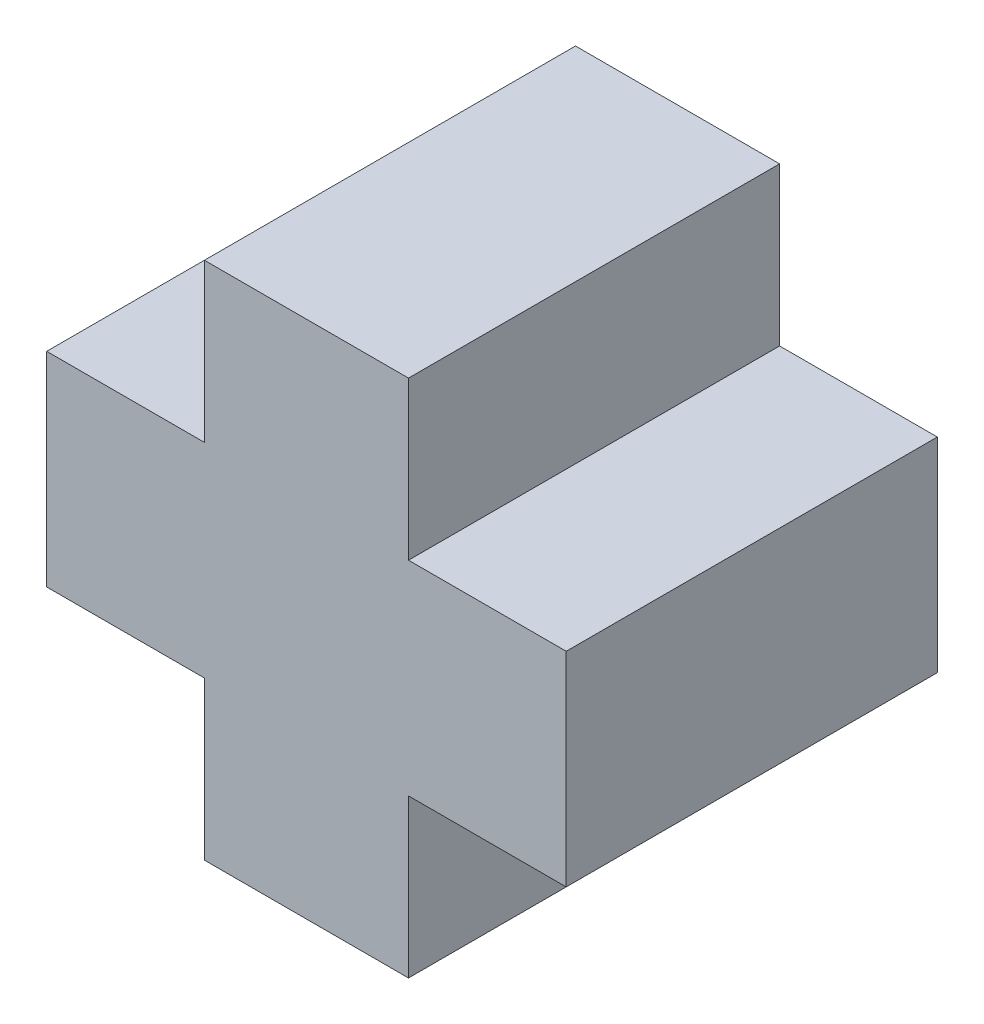
ISO-10303-21;
HEADER;
FILE_DESCRIPTION(('STEP AP214'),'2;1');
FILE_NAME('part.step','',(''),(''),'','','');
FILE_SCHEMA(('AUTOMOTIVE_DESIGN { 1 0 10303 214 1 1 1 1 }'));
ENDSEC;
DATA;
#1=APPLICATION_CONTEXT('core data for automotive mechanical design processes');
#2=APPLICATION_PROTOCOL_DEFINITION('international standard','automotive_design',2000,#1);
#3=PRODUCT_CONTEXT('',#1,'mechanical');
#4=PRODUCT('Part','Part','',(#3));
#5=PRODUCT_RELATED_PRODUCT_CATEGORY('part','',(#4));
#6=PRODUCT_DEFINITION_FORMATION('','',#4);
#7=PRODUCT_DEFINITION_CONTEXT('part definition',#1,'design');
#8=PRODUCT_DEFINITION('design','',#6,#7);
#9=PRODUCT_DEFINITION_SHAPE('','',#8);
#10=(LENGTH_UNIT() NAMED_UNIT(*) SI_UNIT(.MILLI.,.METRE.));
#11=(NAMED_UNIT(*) PLANE_ANGLE_UNIT() SI_UNIT($,.RADIAN.));
#12=(NAMED_UNIT(*) SI_UNIT($,.STERADIAN.) SOLID_ANGLE_UNIT());
#13=UNCERTAINTY_MEASURE_WITH_UNIT(LENGTH_MEASURE(1.E-05),#10,'distance_accuracy_value','');
#14=(GEOMETRIC_REPRESENTATION_CONTEXT(3) GLOBAL_UNCERTAINTY_ASSIGNED_CONTEXT((#13)) GLOBAL_UNIT_ASSIGNED_CONTEXT((#10,
#11,#12)) REPRESENTATION_CONTEXT('',''));
#15=CARTESIAN_POINT('',(0.,0.,0.));
#16=DIRECTION('',(0.,0.,1.));
#17=DIRECTION('',(1.,0.,0.));
#18=AXIS2_PLACEMENT_3D('',#15,#16,#17);
#19=CARTESIAN_POINT('',(-2.75,-2.75,10.));
#20=DIRECTION('',(0.,1.,0.));
#21=DIRECTION('',(-1.,0.,0.));
#22=AXIS2_PLACEMENT_3D('',#19,#20,#21);
#23=PLANE('',#22);
#24=DIRECTION('',(1.,0.,0.));
#25=VECTOR('',#24,1.);
#26=CARTESIAN_POINT('',(-2.75,-2.75,0.));
#27=LINE('',#26,#25);
#28=CARTESIAN_POINT('',(-7.,-2.75,0.));
#29=VERTEX_POINT('',#28);
#30=CARTESIAN_POINT('',(-2.75,-2.75,0.));
#31=VERTEX_POINT('',#30);
#32=EDGE_CURVE('E164',#29,#31,#27,.T.);
#33=ORIENTED_EDGE('',*,*,#32,.T.);
#34=DIRECTION('',(0.,0.,-1.));
#35=VECTOR('',#34,1.);
#36=CARTESIAN_POINT('',(-2.75,-2.75,10.));
#37=LINE('',#36,#35);
#38=CARTESIAN_POINT('',(-2.75,-2.75,10.));
#39=VERTEX_POINT('',#38);
#40=EDGE_CURVE('E11',#39,#31,#37,.T.);
#41=ORIENTED_EDGE('',*,*,#40,.F.);
#42=DIRECTION('',(1.,0.,0.));
#43=VECTOR('',#42,1.);
#44=CARTESIAN_POINT('',(-2.75,-2.75,10.));
#45=LINE('',#44,#43);
#46=CARTESIAN_POINT('',(-7.,-2.75,10.));
#47=VERTEX_POINT('',#46);
#48=EDGE_CURVE('E198',#47,#39,#45,.T.);
#49=ORIENTED_EDGE('',*,*,#48,.F.);
#50=DIRECTION('',(0.,0.,-1.));
#51=VECTOR('',#50,1.);
#52=CARTESIAN_POINT('',(-7.,-2.75,10.));
#53=LINE('',#52,#51);
#54=EDGE_CURVE('E160',#47,#29,#53,.T.);
#55=ORIENTED_EDGE('',*,*,#54,.T.);
#56=EDGE_LOOP('',(#33,#41,#49,#55));
#57=FACE_BOUND('',#56,.T.);
#58=ADVANCED_FACE('F39',(#57),#23,.F.);
#59=CARTESIAN_POINT('',(-2.75,-7.,10.));
#60=DIRECTION('',(1.,0.,0.));
#61=DIRECTION('',(0.,1.,0.));
#62=AXIS2_PLACEMENT_3D('',#59,#60,#61);
#63=PLANE('',#62);
#64=DIRECTION('',(0.,-1.,0.));
#65=VECTOR('',#64,1.);
#66=CARTESIAN_POINT('',(-2.75,-7.,0.));
#67=LINE('',#66,#65);
#68=CARTESIAN_POINT('',(-2.75,-7.,0.));
#69=VERTEX_POINT('',#68);
#70=EDGE_CURVE('E168',#31,#69,#67,.T.);
#71=ORIENTED_EDGE('',*,*,#70,.T.);
#72=DIRECTION('',(0.,0.,-1.));
#73=VECTOR('',#72,1.);
#74=CARTESIAN_POINT('',(-2.75,-7.,10.));
#75=LINE('',#74,#73);
#76=CARTESIAN_POINT('',(-2.75,-7.,10.));
#77=VERTEX_POINT('',#76);
#78=EDGE_CURVE('E48',#77,#69,#75,.T.);
#79=ORIENTED_EDGE('',*,*,#78,.F.);
#80=DIRECTION('',(0.,-1.,0.));
#81=VECTOR('',#80,1.);
#82=CARTESIAN_POINT('',(-2.75,-7.,10.));
#83=LINE('',#82,#81);
#84=EDGE_CURVE('E111',#39,#77,#83,.T.);
#85=ORIENTED_EDGE('',*,*,#84,.F.);
#86=ORIENTED_EDGE('',*,*,#40,.T.);
#87=EDGE_LOOP('',(#71,#79,#85,#86));
#88=FACE_BOUND('',#87,.T.);
#89=ADVANCED_FACE('F292',(#88),#63,.F.);
#90=CARTESIAN_POINT('',(2.75,-7.,10.));
#91=DIRECTION('',(0.,1.,0.));
#92=DIRECTION('',(-1.,0.,0.));
#93=AXIS2_PLACEMENT_3D('',#90,#91,#92);
#94=PLANE('',#93);
#95=DIRECTION('',(1.,0.,0.));
#96=VECTOR('',#95,1.);
#97=CARTESIAN_POINT('',(2.75,-7.,0.));
#98=LINE('',#97,#96);
#99=CARTESIAN_POINT('',(2.75,-7.,0.));
#100=VERTEX_POINT('',#99);
#101=EDGE_CURVE('E171',#69,#100,#98,.T.);
#102=ORIENTED_EDGE('',*,*,#101,.T.);
#103=DIRECTION('',(0.,0.,-1.));
#104=VECTOR('',#103,1.);
#105=CARTESIAN_POINT('',(2.75,-7.,10.));
#106=LINE('',#105,#104);
#107=CARTESIAN_POINT('',(2.75,-7.,10.));
#108=VERTEX_POINT('',#107);
#109=EDGE_CURVE('E225',#108,#100,#106,.T.);
#110=ORIENTED_EDGE('',*,*,#109,.F.);
#111=DIRECTION('',(1.,0.,0.));
#112=VECTOR('',#111,1.);
#113=CARTESIAN_POINT('',(2.75,-7.,10.));
#114=LINE('',#113,#112);
#115=EDGE_CURVE('E235',#77,#108,#114,.T.);
#116=ORIENTED_EDGE('',*,*,#115,.F.);
#117=ORIENTED_EDGE('',*,*,#78,.T.);
#118=EDGE_LOOP('',(#102,#110,#116,#117));
#119=FACE_BOUND('',#118,.T.);
#120=ADVANCED_FACE('F233',(#119),#94,.F.);
#121=CARTESIAN_POINT('',(2.75,-7.,10.));
#122=DIRECTION('',(-1.,0.,0.));
#123=DIRECTION('',(0.,0.,1.));
#124=AXIS2_PLACEMENT_3D('',#121,#122,#123);
#125=PLANE('',#124);
#126=DIRECTION('',(0.,1.,0.));
#127=VECTOR('',#126,1.);
#128=CARTESIAN_POINT('',(2.75,-7.,0.));
#129=LINE('',#128,#127);
#130=CARTESIAN_POINT('',(2.75,-2.75,0.));
#131=VERTEX_POINT('',#130);
#132=EDGE_CURVE('E174',#100,#131,#129,.T.);
#133=ORIENTED_EDGE('',*,*,#132,.T.);
#134=DIRECTION('',(0.,0.,-1.));
#135=VECTOR('',#134,1.);
#136=CARTESIAN_POINT('',(2.75,-2.75,10.));
#137=LINE('',#136,#135);
#138=CARTESIAN_POINT('',(2.75,-2.75,10.));
#139=VERTEX_POINT('',#138);
#140=EDGE_CURVE('E221',#139,#131,#137,.T.);
#141=ORIENTED_EDGE('',*,*,#140,.F.);
#142=DIRECTION('',(0.,1.,0.));
#143=VECTOR('',#142,1.);
#144=CARTESIAN_POINT('',(2.75,-7.,10.));
#145=LINE('',#144,#143);
#146=EDGE_CURVE('E254',#108,#139,#145,.T.);
#147=ORIENTED_EDGE('',*,*,#146,.F.);
#148=ORIENTED_EDGE('',*,*,#109,.T.);
#149=EDGE_LOOP('',(#133,#141,#147,#148));
#150=FACE_BOUND('',#149,.T.);
#151=ADVANCED_FACE('F244',(#150),#125,.F.);
#152=CARTESIAN_POINT('',(7.,-2.75,10.));
#153=DIRECTION('',(0.,1.,0.));
#154=DIRECTION('',(0.,0.,1.));
#155=AXIS2_PLACEMENT_3D('',#152,#153,#154);
#156=PLANE('',#155);
#157=DIRECTION('',(1.,0.,0.));
#158=VECTOR('',#157,1.);
#159=CARTESIAN_POINT('',(7.,-2.75,0.));
#160=LINE('',#159,#158);
#161=CARTESIAN_POINT('',(7.,-2.75,0.));
#162=VERTEX_POINT('',#161);
#163=EDGE_CURVE('E177',#131,#162,#160,.T.);
#164=ORIENTED_EDGE('',*,*,#163,.T.);
#165=DIRECTION('',(0.,0.,-1.));
#166=VECTOR('',#165,1.);
#167=CARTESIAN_POINT('',(7.,-2.75,10.));
#168=LINE('',#167,#166);
#169=CARTESIAN_POINT('',(7.,-2.75,10.));
#170=VERTEX_POINT('',#169);
#171=EDGE_CURVE('E217',#170,#162,#168,.T.);
#172=ORIENTED_EDGE('',*,*,#171,.F.);
#173=DIRECTION('',(1.,0.,0.));
#174=VECTOR('',#173,1.);
#175=CARTESIAN_POINT('',(7.,-2.75,10.));
#176=LINE('',#175,#174);
#177=EDGE_CURVE('E250',#139,#170,#176,.T.);
#178=ORIENTED_EDGE('',*,*,#177,.F.);
#179=ORIENTED_EDGE('',*,*,#140,.T.);
#180=EDGE_LOOP('',(#164,#172,#178,#179));
#181=FACE_BOUND('',#180,.T.);
#182=ADVANCED_FACE('F248',(#181),#156,.F.);
#183=CARTESIAN_POINT('',(7.,2.75,10.));
#184=DIRECTION('',(-1.,0.,0.));
#185=DIRECTION('',(0.,0.,1.));
#186=AXIS2_PLACEMENT_3D('',#183,#184,#185);
#187=PLANE('',#186);
#188=DIRECTION('',(0.,1.,0.));
#189=VECTOR('',#188,1.);
#190=CARTESIAN_POINT('',(7.,2.75,0.));
#191=LINE('',#190,#189);
#192=CARTESIAN_POINT('',(7.,2.75,0.));
#193=VERTEX_POINT('',#192);
#194=EDGE_CURVE('E180',#162,#193,#191,.T.);
#195=ORIENTED_EDGE('',*,*,#194,.T.);
#196=DIRECTION('',(0.,0.,-1.));
#197=VECTOR('',#196,1.);
#198=CARTESIAN_POINT('',(7.,2.75,10.));
#199=LINE('',#198,#197);
#200=CARTESIAN_POINT('',(7.,2.75,10.));
#201=VERTEX_POINT('',#200);
#202=EDGE_CURVE('E213',#201,#193,#199,.T.);
#203=ORIENTED_EDGE('',*,*,#202,.F.);
#204=DIRECTION('',(0.,1.,0.));
#205=VECTOR('',#204,1.);
#206=CARTESIAN_POINT('',(7.,2.75,10.));
#207=LINE('',#206,#205);
#208=EDGE_CURVE('E253',#170,#201,#207,.T.);
#209=ORIENTED_EDGE('',*,*,#208,.F.);
#210=ORIENTED_EDGE('',*,*,#171,.T.);
#211=EDGE_LOOP('',(#195,#203,#209,#210));
#212=FACE_BOUND('',#211,.T.);
#213=ADVANCED_FACE('F305',(#212),#187,.F.);
#214=CARTESIAN_POINT('',(7.,2.75,10.));
#215=DIRECTION('',(0.,-1.,0.));
#216=DIRECTION('',(1.,0.,0.));
#217=AXIS2_PLACEMENT_3D('',#214,#215,#216);
#218=PLANE('',#217);
#219=DIRECTION('',(-1.,0.,0.));
#220=VECTOR('',#219,1.);
#221=CARTESIAN_POINT('',(7.,2.75,0.));
#222=LINE('',#221,#220);
#223=CARTESIAN_POINT('',(2.75,2.75,0.));
#224=VERTEX_POINT('',#223);
#225=EDGE_CURVE('E183',#193,#224,#222,.T.);
#226=ORIENTED_EDGE('',*,*,#225,.T.);
#227=DIRECTION('',(0.,0.,-1.));
#228=VECTOR('',#227,1.);
#229=CARTESIAN_POINT('',(2.75,2.75,10.));
#230=LINE('',#229,#228);
#231=CARTESIAN_POINT('',(2.75,2.75,10.));
#232=VERTEX_POINT('',#231);
#233=EDGE_CURVE('E209',#232,#224,#230,.T.);
#234=ORIENTED_EDGE('',*,*,#233,.F.);
#235=DIRECTION('',(-1.,0.,0.));
#236=VECTOR('',#235,1.);
#237=CARTESIAN_POINT('',(7.,2.75,10.));
#238=LINE('',#237,#236);
#239=EDGE_CURVE('E258',#201,#232,#238,.T.);
#240=ORIENTED_EDGE('',*,*,#239,.F.);
#241=ORIENTED_EDGE('',*,*,#202,.T.);
#242=EDGE_LOOP('',(#226,#234,#240,#241));
#243=FACE_BOUND('',#242,.T.);
#244=ADVANCED_FACE('F308',(#243),#218,.F.);
#245=CARTESIAN_POINT('',(2.75,2.75,10.));
#246=DIRECTION('',(-1.,0.,0.));
#247=DIRECTION('',(0.,-1.,0.));
#248=AXIS2_PLACEMENT_3D('',#245,#246,#247);
#249=PLANE('',#248);
#250=DIRECTION('',(0.,1.,0.));
#251=VECTOR('',#250,1.);
#252=CARTESIAN_POINT('',(2.75,2.75,0.));
#253=LINE('',#252,#251);
#254=CARTESIAN_POINT('',(2.75,7.,0.));
#255=VERTEX_POINT('',#254);
#256=EDGE_CURVE('E186',#224,#255,#253,.T.);
#257=ORIENTED_EDGE('',*,*,#256,.T.);
#258=DIRECTION('',(0.,0.,-1.));
#259=VECTOR('',#258,1.);
#260=CARTESIAN_POINT('',(2.75,7.,10.));
#261=LINE('',#260,#259);
#262=CARTESIAN_POINT('',(2.75,7.,10.));
#263=VERTEX_POINT('',#262);
#264=EDGE_CURVE('E205',#263,#255,#261,.T.);
#265=ORIENTED_EDGE('',*,*,#264,.F.);
#266=DIRECTION('',(0.,1.,0.));
#267=VECTOR('',#266,1.);
#268=CARTESIAN_POINT('',(2.75,2.75,10.));
#269=LINE('',#268,#267);
#270=EDGE_CURVE('E265',#232,#263,#269,.T.);
#271=ORIENTED_EDGE('',*,*,#270,.F.);
#272=ORIENTED_EDGE('',*,*,#233,.T.);
#273=EDGE_LOOP('',(#257,#265,#271,#272));
#274=FACE_BOUND('',#273,.T.);
#275=ADVANCED_FACE('F273',(#274),#249,.F.);
#276=CARTESIAN_POINT('',(2.75,7.,10.));
#277=DIRECTION('',(0.,-1.,0.));
#278=DIRECTION('',(1.,0.,0.));
#279=AXIS2_PLACEMENT_3D('',#276,#277,#278);
#280=PLANE('',#279);
#281=DIRECTION('',(-1.,0.,0.));
#282=VECTOR('',#281,1.);
#283=CARTESIAN_POINT('',(2.75,7.,0.));
#284=LINE('',#283,#282);
#285=CARTESIAN_POINT('',(-2.75,7.,0.));
#286=VERTEX_POINT('',#285);
#287=EDGE_CURVE('E189',#255,#286,#284,.T.);
#288=ORIENTED_EDGE('',*,*,#287,.T.);
#289=DIRECTION('',(0.,0.,-1.));
#290=VECTOR('',#289,1.);
#291=CARTESIAN_POINT('',(-2.75,7.,10.));
#292=LINE('',#291,#290);
#293=CARTESIAN_POINT('',(-2.75,7.,10.));
#294=VERTEX_POINT('',#293);
#295=EDGE_CURVE('E153',#294,#286,#292,.T.);
#296=ORIENTED_EDGE('',*,*,#295,.F.);
#297=DIRECTION('',(-1.,0.,0.));
#298=VECTOR('',#297,1.);
#299=CARTESIAN_POINT('',(2.75,7.,10.));
#300=LINE('',#299,#298);
#301=EDGE_CURVE('E142',#263,#294,#300,.T.);
#302=ORIENTED_EDGE('',*,*,#301,.F.);
#303=ORIENTED_EDGE('',*,*,#264,.T.);
#304=EDGE_LOOP('',(#288,#296,#302,#303));
#305=FACE_BOUND('',#304,.T.);
#306=ADVANCED_FACE('F277',(#305),#280,.F.);
#307=CARTESIAN_POINT('',(-2.75,2.75,10.));
#308=DIRECTION('',(1.,0.,0.));
#309=DIRECTION('',(0.,1.,0.));
#310=AXIS2_PLACEMENT_3D('',#307,#308,#309);
#311=PLANE('',#310);
#312=DIRECTION('',(0.,-1.,0.));
#313=VECTOR('',#312,1.);
#314=CARTESIAN_POINT('',(-2.75,2.75,0.));
#315=LINE('',#314,#313);
#316=CARTESIAN_POINT('',(-2.75,2.75,0.));
#317=VERTEX_POINT('',#316);
#318=EDGE_CURVE('E151',#286,#317,#315,.T.);
#319=ORIENTED_EDGE('',*,*,#318,.T.);
#320=DIRECTION('',(0.,0.,-1.));
#321=VECTOR('',#320,1.);
#322=CARTESIAN_POINT('',(-2.75,2.75,10.));
#323=LINE('',#322,#321);
#324=CARTESIAN_POINT('',(-2.75,2.75,10.));
#325=VERTEX_POINT('',#324);
#326=EDGE_CURVE('E148',#325,#317,#323,.T.);
#327=ORIENTED_EDGE('',*,*,#326,.F.);
#328=DIRECTION('',(0.,-1.,0.));
#329=VECTOR('',#328,1.);
#330=CARTESIAN_POINT('',(-2.75,2.75,10.));
#331=LINE('',#330,#329);
#332=EDGE_CURVE('E136',#294,#325,#331,.T.);
#333=ORIENTED_EDGE('',*,*,#332,.F.);
#334=ORIENTED_EDGE('',*,*,#295,.T.);
#335=EDGE_LOOP('',(#319,#327,#333,#334));
#336=FACE_BOUND('',#335,.T.);
#337=ADVANCED_FACE('F149',(#336),#311,.F.);
#338=CARTESIAN_POINT('',(-2.75,2.75,10.));
#339=DIRECTION('',(0.,-1.,0.));
#340=DIRECTION('',(1.,0.,0.));
#341=AXIS2_PLACEMENT_3D('',#338,#339,#340);
#342=PLANE('',#341);
#343=DIRECTION('',(-1.,0.,0.));
#344=VECTOR('',#343,1.);
#345=CARTESIAN_POINT('',(-2.75,2.75,0.));
#346=LINE('',#345,#344);
#347=CARTESIAN_POINT('',(-7.,2.75,0.));
#348=VERTEX_POINT('',#347);
#349=EDGE_CURVE('E97',#317,#348,#346,.T.);
#350=ORIENTED_EDGE('',*,*,#349,.T.);
#351=DIRECTION('',(0.,0.,-1.));
#352=VECTOR('',#351,1.);
#353=CARTESIAN_POINT('',(-7.,2.75,10.));
#354=LINE('',#353,#352);
#355=CARTESIAN_POINT('',(-7.,2.75,10.));
#356=VERTEX_POINT('',#355);
#357=EDGE_CURVE('E154',#356,#348,#354,.T.);
#358=ORIENTED_EDGE('',*,*,#357,.F.);
#359=DIRECTION('',(-1.,0.,0.));
#360=VECTOR('',#359,1.);
#361=CARTESIAN_POINT('',(-2.75,2.75,10.));
#362=LINE('',#361,#360);
#363=EDGE_CURVE('E140',#325,#356,#362,.T.);
#364=ORIENTED_EDGE('',*,*,#363,.F.);
#365=ORIENTED_EDGE('',*,*,#326,.T.);
#366=EDGE_LOOP('',(#350,#358,#364,#365));
#367=FACE_BOUND('',#366,.T.);
#368=ADVANCED_FACE('F156',(#367),#342,.F.);
#369=CARTESIAN_POINT('',(-7.,2.75,10.));
#370=DIRECTION('',(1.,0.,0.));
#371=DIRECTION('',(0.,0.,-1.));
#372=AXIS2_PLACEMENT_3D('',#369,#370,#371);
#373=PLANE('',#372);
#374=DIRECTION('',(0.,-1.,0.));
#375=VECTOR('',#374,1.);
#376=CARTESIAN_POINT('',(-7.,2.75,0.));
#377=LINE('',#376,#375);
#378=EDGE_CURVE('E103',#348,#29,#377,.T.);
#379=ORIENTED_EDGE('',*,*,#378,.T.);
#380=ORIENTED_EDGE('',*,*,#54,.F.);
#381=DIRECTION('',(0.,-1.,0.));
#382=VECTOR('',#381,1.);
#383=CARTESIAN_POINT('',(-7.,2.75,10.));
#384=LINE('',#383,#382);
#385=EDGE_CURVE('E56',#356,#47,#384,.T.);
#386=ORIENTED_EDGE('',*,*,#385,.F.);
#387=ORIENTED_EDGE('',*,*,#357,.T.);
#388=EDGE_LOOP('',(#379,#380,#386,#387));
#389=FACE_BOUND('',#388,.T.);
#390=ADVANCED_FACE('F281',(#389),#373,.F.);
#391=CARTESIAN_POINT('',(0.,0.,10.));
#392=DIRECTION('',(0.,0.,1.));
#393=DIRECTION('',(1.,0.,0.));
#394=AXIS2_PLACEMENT_3D('',#391,#392,#393);
#395=PLANE('',#394);
#396=ORIENTED_EDGE('',*,*,#48,.T.);
#397=ORIENTED_EDGE('',*,*,#84,.T.);
#398=ORIENTED_EDGE('',*,*,#115,.T.);
#399=ORIENTED_EDGE('',*,*,#146,.T.);
#400=ORIENTED_EDGE('',*,*,#177,.T.);
#401=ORIENTED_EDGE('',*,*,#208,.T.);
#402=ORIENTED_EDGE('',*,*,#239,.T.);
#403=ORIENTED_EDGE('',*,*,#270,.T.);
#404=ORIENTED_EDGE('',*,*,#301,.T.);
#405=ORIENTED_EDGE('',*,*,#332,.T.);
#406=ORIENTED_EDGE('',*,*,#363,.T.);
#407=ORIENTED_EDGE('',*,*,#385,.T.);
#408=EDGE_LOOP('',(#396,#397,#398,#399,#400,#401,#402,#403,#404,#405,#406,#407));
#409=FACE_BOUND('',#408,.T.);
#410=ADVANCED_FACE('F138',(#409),#395,.T.);
#411=CARTESIAN_POINT('',(0.,0.,0.));
#412=DIRECTION('',(0.,0.,1.));
#413=DIRECTION('',(1.,0.,0.));
#414=AXIS2_PLACEMENT_3D('',#411,#412,#413);
#415=PLANE('',#414);
#416=ORIENTED_EDGE('',*,*,#32,.F.);
#417=ORIENTED_EDGE('',*,*,#378,.F.);
#418=ORIENTED_EDGE('',*,*,#349,.F.);
#419=ORIENTED_EDGE('',*,*,#318,.F.);
#420=ORIENTED_EDGE('',*,*,#287,.F.);
#421=ORIENTED_EDGE('',*,*,#256,.F.);
#422=ORIENTED_EDGE('',*,*,#225,.F.);
#423=ORIENTED_EDGE('',*,*,#194,.F.);
#424=ORIENTED_EDGE('',*,*,#163,.F.);
#425=ORIENTED_EDGE('',*,*,#132,.F.);
#426=ORIENTED_EDGE('',*,*,#101,.F.);
#427=ORIENTED_EDGE('',*,*,#70,.F.);
#428=EDGE_LOOP('',(#416,#417,#418,#419,#420,#421,#422,#423,#424,#425,#426,#427));
#429=FACE_BOUND('',#428,.T.);
#430=ADVANCED_FACE('F239',(#429),#415,.F.);
#431=CLOSED_SHELL('',(#58,#89,#120,#151,#182,#213,#244,#275,#306,#337,#368,#390,#410,#430));
#432=MANIFOLD_SOLID_BREP('B2',#431);
#433=ADVANCED_BREP_SHAPE_REPRESENTATION('',(#18,#432),#14);
#434=SHAPE_DEFINITION_REPRESENTATION(#9,#433);
ENDSEC;
END-ISO-10303-21;
